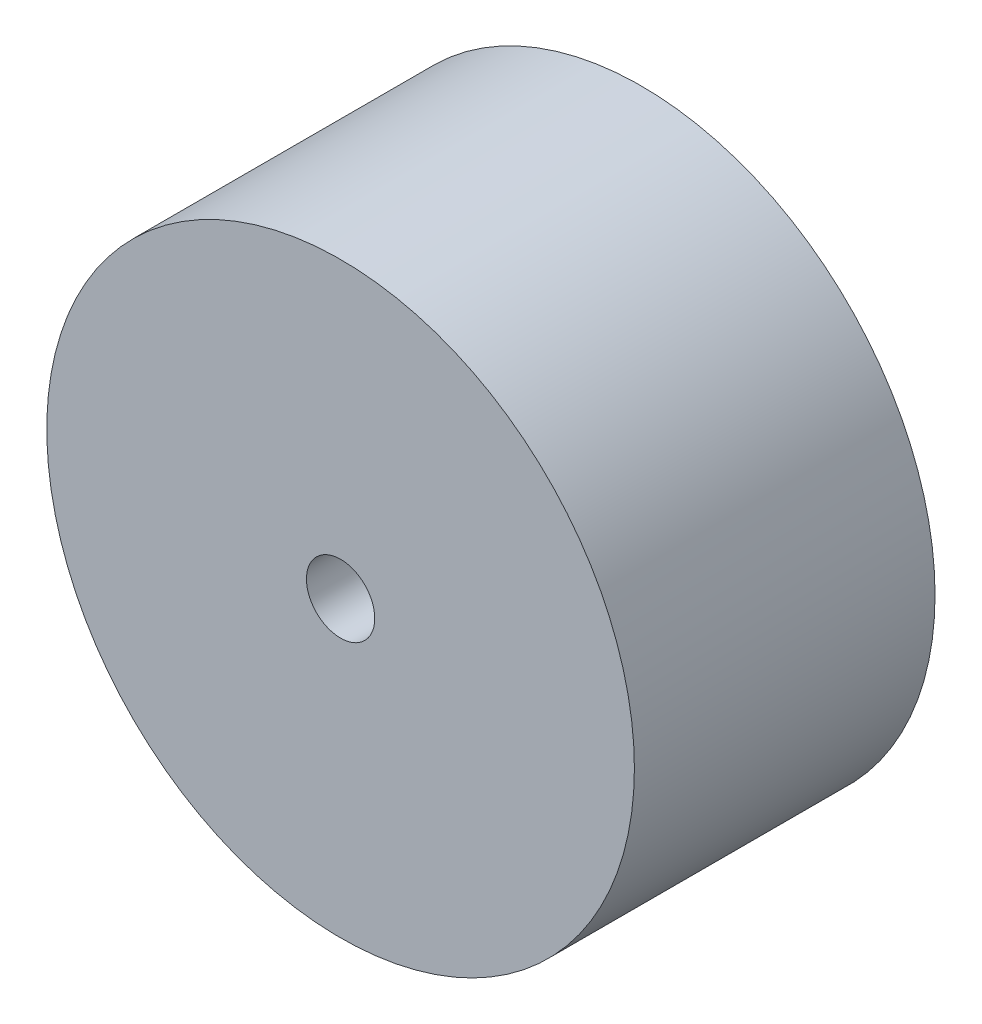
ISO-10303-21;
HEADER;
FILE_DESCRIPTION(('STEP AP214'),'2;1');
FILE_NAME('part.step','',(''),(''),'','','');
FILE_SCHEMA(('AUTOMOTIVE_DESIGN { 1 0 10303 214 1 1 1 1 }'));
ENDSEC;
DATA;
#1=APPLICATION_CONTEXT('core data for automotive mechanical design processes');
#2=APPLICATION_PROTOCOL_DEFINITION('international standard','automotive_design',2000,#1);
#3=PRODUCT_CONTEXT('',#1,'mechanical');
#4=PRODUCT('Part','Part','',(#3));
#5=PRODUCT_RELATED_PRODUCT_CATEGORY('part','',(#4));
#6=PRODUCT_DEFINITION_FORMATION('','',#4);
#7=PRODUCT_DEFINITION_CONTEXT('part definition',#1,'design');
#8=PRODUCT_DEFINITION('design','',#6,#7);
#9=PRODUCT_DEFINITION_SHAPE('','',#8);
#10=(LENGTH_UNIT() NAMED_UNIT(*) SI_UNIT(.MILLI.,.METRE.));
#11=(NAMED_UNIT(*) PLANE_ANGLE_UNIT() SI_UNIT($,.RADIAN.));
#12=(NAMED_UNIT(*) SI_UNIT($,.STERADIAN.) SOLID_ANGLE_UNIT());
#13=UNCERTAINTY_MEASURE_WITH_UNIT(LENGTH_MEASURE(1.E-05),#10,'distance_accuracy_value','');
#14=(GEOMETRIC_REPRESENTATION_CONTEXT(3) GLOBAL_UNCERTAINTY_ASSIGNED_CONTEXT((#13)) GLOBAL_UNIT_ASSIGNED_CONTEXT((#10,
#11,#12)) REPRESENTATION_CONTEXT('',''));
#15=CARTESIAN_POINT('',(0.,0.,0.));
#16=DIRECTION('',(0.,0.,1.));
#17=DIRECTION('',(1.,0.,0.));
#18=AXIS2_PLACEMENT_3D('',#15,#16,#17);
#19=CARTESIAN_POINT('',(0.,0.,22.));
#20=DIRECTION('',(0.,0.,1.));
#21=DIRECTION('',(1.,0.,0.));
#22=AXIS2_PLACEMENT_3D('',#19,#20,#21);
#23=PLANE('',#22);
#24=CARTESIAN_POINT('',(0.,0.,22.));
#25=DIRECTION('',(0.,0.,1.));
#26=DIRECTION('',(1.,0.,0.));
#27=AXIS2_PLACEMENT_3D('',#24,#25,#26);
#28=CIRCLE('',#27,21.5);
#29=CARTESIAN_POINT('',(21.5,0.,22.));
#30=VERTEX_POINT('',#29);
#31=EDGE_CURVE('E10',#30,#30,#28,.T.);
#32=ORIENTED_EDGE('',*,*,#31,.T.);
#33=EDGE_LOOP('',(#32));
#34=FACE_BOUND('',#33,.T.);
#35=CARTESIAN_POINT('',(0.,0.,22.));
#36=DIRECTION('',(0.,0.,1.));
#37=DIRECTION('',(1.,0.,0.));
#38=AXIS2_PLACEMENT_3D('',#35,#36,#37);
#39=CIRCLE('',#38,2.5);
#40=CARTESIAN_POINT('',(2.5,0.,22.));
#41=VERTEX_POINT('',#40);
#42=EDGE_CURVE('E54',#41,#41,#39,.T.);
#43=ORIENTED_EDGE('',*,*,#42,.F.);
#44=EDGE_LOOP('',(#43));
#45=FACE_BOUND('',#44,.T.);
#46=ADVANCED_FACE('F41',(#34,#45),#23,.T.);
#47=CARTESIAN_POINT('',(0.,0.,0.));
#48=DIRECTION('',(0.,0.,1.));
#49=DIRECTION('',(1.,0.,0.));
#50=AXIS2_PLACEMENT_3D('',#47,#48,#49);
#51=PLANE('',#50);
#52=CARTESIAN_POINT('',(0.,0.,0.));
#53=DIRECTION('',(0.,0.,1.));
#54=DIRECTION('',(1.,0.,0.));
#55=AXIS2_PLACEMENT_3D('',#52,#53,#54);
#56=CIRCLE('',#55,21.5);
#57=CARTESIAN_POINT('',(21.5,0.,0.));
#58=VERTEX_POINT('',#57);
#59=EDGE_CURVE('E45',#58,#58,#56,.T.);
#60=ORIENTED_EDGE('',*,*,#59,.F.);
#61=EDGE_LOOP('',(#60));
#62=FACE_BOUND('',#61,.T.);
#63=CARTESIAN_POINT('',(0.,0.,0.));
#64=DIRECTION('',(0.,0.,1.));
#65=DIRECTION('',(1.,0.,0.));
#66=AXIS2_PLACEMENT_3D('',#63,#64,#65);
#67=CIRCLE('',#66,2.5);
#68=CARTESIAN_POINT('',(2.5,0.,0.));
#69=VERTEX_POINT('',#68);
#70=EDGE_CURVE('E56',#69,#69,#67,.T.);
#71=ORIENTED_EDGE('',*,*,#70,.T.);
#72=EDGE_LOOP('',(#71));
#73=FACE_BOUND('',#72,.T.);
#74=ADVANCED_FACE('F68',(#62,#73),#51,.F.);
#75=CARTESIAN_POINT('',(0.,0.,22.));
#76=DIRECTION('',(0.,0.,-1.));
#77=DIRECTION('',(-1.,0.,0.));
#78=AXIS2_PLACEMENT_3D('',#75,#76,#77);
#79=CYLINDRICAL_SURFACE('',#78,21.5);
#80=ORIENTED_EDGE('',*,*,#31,.F.);
#81=EDGE_LOOP('',(#80));
#82=FACE_BOUND('',#81,.T.);
#83=ORIENTED_EDGE('',*,*,#59,.T.);
#84=EDGE_LOOP('',(#83));
#85=FACE_BOUND('',#84,.T.);
#86=ADVANCED_FACE('F43',(#82,#85),#79,.T.);
#87=CARTESIAN_POINT('',(0.,0.,22.));
#88=DIRECTION('',(0.,0.,-1.));
#89=DIRECTION('',(-1.,0.,0.));
#90=AXIS2_PLACEMENT_3D('',#87,#88,#89);
#91=CYLINDRICAL_SURFACE('',#90,2.5);
#92=ORIENTED_EDGE('',*,*,#42,.T.);
#93=EDGE_LOOP('',(#92));
#94=FACE_BOUND('',#93,.T.);
#95=ORIENTED_EDGE('',*,*,#70,.F.);
#96=EDGE_LOOP('',(#95));
#97=FACE_BOUND('',#96,.T.);
#98=ADVANCED_FACE('F64',(#94,#97),#91,.F.);
#99=CLOSED_SHELL('',(#46,#74,#86,#98));
#100=MANIFOLD_SOLID_BREP('B2',#99);
#101=ADVANCED_BREP_SHAPE_REPRESENTATION('',(#18,#100),#14);
#102=SHAPE_DEFINITION_REPRESENTATION(#9,#101);
ENDSEC;
END-ISO-10303-21;
